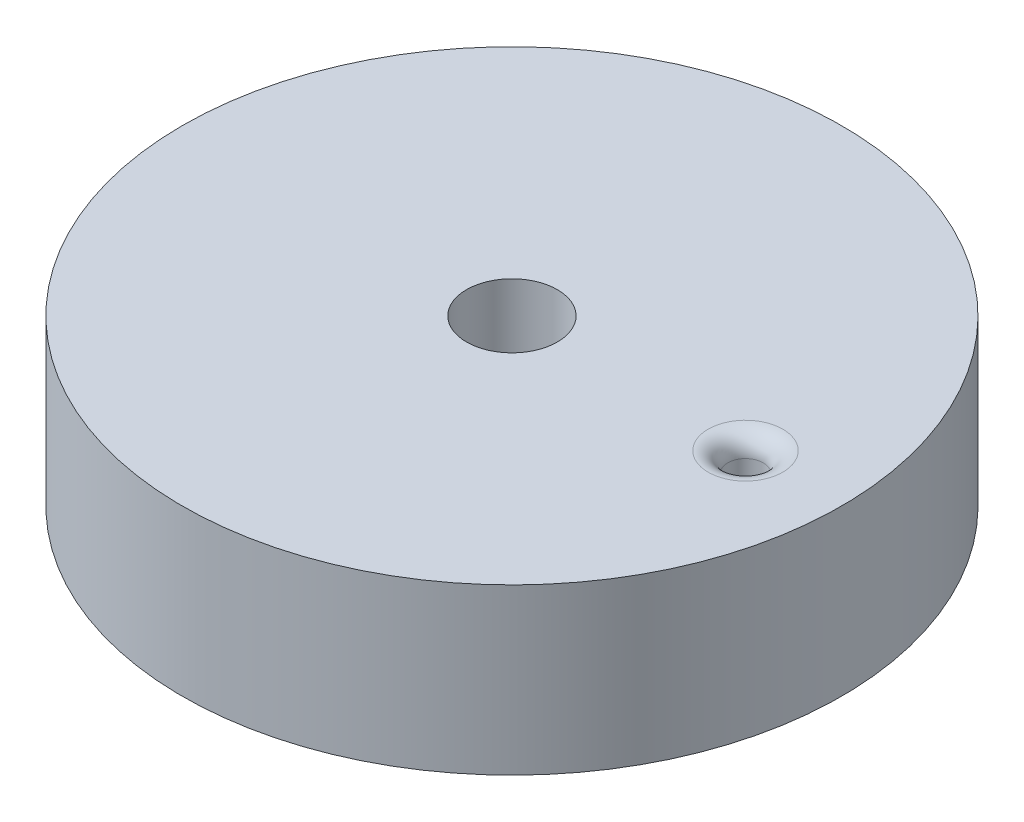
ISO-10303-21;
HEADER;
FILE_DESCRIPTION(('STEP AP214'),'2;1');
FILE_NAME('part.step','',(''),(''),'','','');
FILE_SCHEMA(('AUTOMOTIVE_DESIGN { 1 0 10303 214 1 1 1 1 }'));
ENDSEC;
DATA;
#1=APPLICATION_CONTEXT('core data for automotive mechanical design processes');
#2=APPLICATION_PROTOCOL_DEFINITION('international standard','automotive_design',2000,#1);
#3=PRODUCT_CONTEXT('',#1,'mechanical');
#4=PRODUCT('Part','Part','',(#3));
#5=PRODUCT_RELATED_PRODUCT_CATEGORY('part','',(#4));
#6=PRODUCT_DEFINITION_FORMATION('','',#4);
#7=PRODUCT_DEFINITION_CONTEXT('part definition',#1,'design');
#8=PRODUCT_DEFINITION('design','',#6,#7);
#9=PRODUCT_DEFINITION_SHAPE('','',#8);
#10=(LENGTH_UNIT() NAMED_UNIT(*) SI_UNIT(.MILLI.,.METRE.));
#11=(NAMED_UNIT(*) PLANE_ANGLE_UNIT() SI_UNIT($,.RADIAN.));
#12=(NAMED_UNIT(*) SI_UNIT($,.STERADIAN.) SOLID_ANGLE_UNIT());
#13=UNCERTAINTY_MEASURE_WITH_UNIT(LENGTH_MEASURE(1.E-05),#10,'distance_accuracy_value','');
#14=(GEOMETRIC_REPRESENTATION_CONTEXT(3) GLOBAL_UNCERTAINTY_ASSIGNED_CONTEXT((#13)) GLOBAL_UNIT_ASSIGNED_CONTEXT((#10,
#11,#12)) REPRESENTATION_CONTEXT('',''));
#15=CARTESIAN_POINT('',(0.,0.,0.));
#16=DIRECTION('',(0.,0.,1.));
#17=DIRECTION('',(1.,0.,0.));
#18=AXIS2_PLACEMENT_3D('',#15,#16,#17);
#19=CARTESIAN_POINT('',(0.,1.5,0.));
#20=DIRECTION('',(0.,-1.,0.));
#21=DIRECTION('',(0.,0.,-1.));
#22=AXIS2_PLACEMENT_3D('',#19,#20,#21);
#23=TOROIDAL_SURFACE('',#22,5.,1.5);
#24=CARTESIAN_POINT('',(0.,0.,0.));
#25=DIRECTION('',(0.,-1.,0.));
#26=DIRECTION('',(1.,0.,0.));
#27=AXIS2_PLACEMENT_3D('',#24,#25,#26);
#28=CIRCLE('',#27,5.);
#29=CARTESIAN_POINT('',(-5.,0.,0.));
#30=VERTEX_POINT('',#29);
#31=EDGE_CURVE('E9',#30,#30,#28,.T.);
#32=ORIENTED_EDGE('',*,*,#31,.T.);
#33=EDGE_LOOP('',(#32));
#34=FACE_BOUND('',#33,.T.);
#35=CARTESIAN_POINT('',(0.,1.5,0.));
#36=DIRECTION('',(0.,1.,0.));
#37=DIRECTION('',(1.,0.,0.));
#38=AXIS2_PLACEMENT_3D('',#35,#36,#37);
#39=CIRCLE('',#38,3.5);
#40=CARTESIAN_POINT('',(-3.5,1.5,0.));
#41=VERTEX_POINT('',#40);
#42=EDGE_CURVE('E26',#41,#41,#39,.T.);
#43=ORIENTED_EDGE('',*,*,#42,.T.);
#44=EDGE_LOOP('',(#43));
#45=FACE_BOUND('',#44,.T.);
#46=ADVANCED_FACE('F15',(#34,#45),#23,.T.);
#47=CARTESIAN_POINT('',(0.,0.,0.));
#48=DIRECTION('',(0.,-1.,0.));
#49=DIRECTION('',(1.,0.,0.));
#50=AXIS2_PLACEMENT_3D('',#47,#48,#49);
#51=CYLINDRICAL_SURFACE('',#50,3.5);
#52=CARTESIAN_POINT('',(0.,12.7,0.));
#53=DIRECTION('',(0.,-1.,0.));
#54=DIRECTION('',(1.,0.,0.));
#55=AXIS2_PLACEMENT_3D('',#52,#53,#54);
#56=CIRCLE('',#55,3.5);
#57=CARTESIAN_POINT('',(-3.5,12.7,0.));
#58=VERTEX_POINT('',#57);
#59=EDGE_CURVE('E51',#58,#58,#56,.T.);
#60=ORIENTED_EDGE('',*,*,#59,.F.);
#61=EDGE_LOOP('',(#60));
#62=FACE_BOUND('',#61,.T.);
#63=ORIENTED_EDGE('',*,*,#42,.F.);
#64=EDGE_LOOP('',(#63));
#65=FACE_BOUND('',#64,.T.);
#66=ADVANCED_FACE('F52',(#62,#65),#51,.F.);
#67=CARTESIAN_POINT('',(0.,0.,0.));
#68=DIRECTION('',(0.,1.,0.));
#69=DIRECTION('',(1.,0.,0.));
#70=AXIS2_PLACEMENT_3D('',#67,#68,#69);
#71=PLANE('',#70);
#72=CARTESIAN_POINT('',(0.,0.,0.));
#73=DIRECTION('',(0.,1.,0.));
#74=DIRECTION('',(1.,0.,0.));
#75=AXIS2_PLACEMENT_3D('',#72,#73,#74);
#76=CIRCLE('',#75,25.4);
#77=CARTESIAN_POINT('',(-25.4,0.,0.));
#78=VERTEX_POINT('',#77);
#79=EDGE_CURVE('E19',#78,#78,#76,.T.);
#80=ORIENTED_EDGE('',*,*,#79,.F.);
#81=EDGE_LOOP('',(#80));
#82=FACE_BOUND('',#81,.T.);
#83=CARTESIAN_POINT('',(18.,0.,0.));
#84=DIRECTION('',(0.,-1.,0.));
#85=DIRECTION('',(1.,0.,0.));
#86=AXIS2_PLACEMENT_3D('',#83,#84,#85);
#87=CIRCLE('',#86,1.375);
#88=CARTESIAN_POINT('',(16.625,0.,0.));
#89=VERTEX_POINT('',#88);
#90=EDGE_CURVE('E63',#89,#89,#87,.T.);
#91=ORIENTED_EDGE('',*,*,#90,.F.);
#92=EDGE_LOOP('',(#91));
#93=FACE_BOUND('',#92,.T.);
#94=ORIENTED_EDGE('',*,*,#31,.F.);
#95=EDGE_LOOP('',(#94));
#96=FACE_BOUND('',#95,.T.);
#97=ADVANCED_FACE('F17',(#82,#93,#96),#71,.F.);
#98=CARTESIAN_POINT('',(18.,11.2,0.));
#99=DIRECTION('',(0.,-1.,0.));
#100=DIRECTION('',(0.,0.,-1.));
#101=AXIS2_PLACEMENT_3D('',#98,#99,#100);
#102=TOROIDAL_SURFACE('',#101,2.875,1.5);
#103=CARTESIAN_POINT('',(18.,11.2,0.));
#104=DIRECTION('',(0.,-1.,0.));
#105=DIRECTION('',(1.,0.,0.));
#106=AXIS2_PLACEMENT_3D('',#103,#104,#105);
#107=CIRCLE('',#106,1.375);
#108=CARTESIAN_POINT('',(16.625,11.2,0.));
#109=VERTEX_POINT('',#108);
#110=EDGE_CURVE('E73',#109,#109,#107,.T.);
#111=ORIENTED_EDGE('',*,*,#110,.T.);
#112=EDGE_LOOP('',(#111));
#113=FACE_BOUND('',#112,.T.);
#114=CARTESIAN_POINT('',(18.,12.7,0.));
#115=DIRECTION('',(0.,1.,0.));
#116=DIRECTION('',(1.,0.,0.));
#117=AXIS2_PLACEMENT_3D('',#114,#115,#116);
#118=CIRCLE('',#117,2.875);
#119=CARTESIAN_POINT('',(15.125,12.7,0.));
#120=VERTEX_POINT('',#119);
#121=EDGE_CURVE('E70',#120,#120,#118,.T.);
#122=ORIENTED_EDGE('',*,*,#121,.T.);
#123=EDGE_LOOP('',(#122));
#124=FACE_BOUND('',#123,.T.);
#125=ADVANCED_FACE('F85',(#113,#124),#102,.T.);
#126=CARTESIAN_POINT('',(18.,0.,0.));
#127=DIRECTION('',(0.,-1.,0.));
#128=DIRECTION('',(1.,0.,0.));
#129=AXIS2_PLACEMENT_3D('',#126,#127,#128);
#130=CYLINDRICAL_SURFACE('',#129,1.375);
#131=ORIENTED_EDGE('',*,*,#90,.T.);
#132=EDGE_LOOP('',(#131));
#133=FACE_BOUND('',#132,.T.);
#134=ORIENTED_EDGE('',*,*,#110,.F.);
#135=EDGE_LOOP('',(#134));
#136=FACE_BOUND('',#135,.T.);
#137=ADVANCED_FACE('F90',(#133,#136),#130,.F.);
#138=CARTESIAN_POINT('',(0.,12.7,0.));
#139=DIRECTION('',(0.,1.,0.));
#140=DIRECTION('',(1.,0.,0.));
#141=AXIS2_PLACEMENT_3D('',#138,#139,#140);
#142=PLANE('',#141);
#143=CARTESIAN_POINT('',(0.,12.7,0.));
#144=DIRECTION('',(0.,1.,0.));
#145=DIRECTION('',(1.,0.,0.));
#146=AXIS2_PLACEMENT_3D('',#143,#144,#145);
#147=CIRCLE('',#146,25.4);
#148=CARTESIAN_POINT('',(-25.4,12.7,0.));
#149=VERTEX_POINT('',#148);
#150=EDGE_CURVE('E56',#149,#149,#147,.T.);
#151=ORIENTED_EDGE('',*,*,#150,.T.);
#152=EDGE_LOOP('',(#151));
#153=FACE_BOUND('',#152,.T.);
#154=ORIENTED_EDGE('',*,*,#59,.T.);
#155=EDGE_LOOP('',(#154));
#156=FACE_BOUND('',#155,.T.);
#157=ORIENTED_EDGE('',*,*,#121,.F.);
#158=EDGE_LOOP('',(#157));
#159=FACE_BOUND('',#158,.T.);
#160=ADVANCED_FACE('F87',(#153,#156,#159),#142,.T.);
#161=CARTESIAN_POINT('',(0.,0.,0.));
#162=DIRECTION('',(0.,-1.,0.));
#163=DIRECTION('',(1.,0.,0.));
#164=AXIS2_PLACEMENT_3D('',#161,#162,#163);
#165=CYLINDRICAL_SURFACE('',#164,25.4);
#166=ORIENTED_EDGE('',*,*,#150,.F.);
#167=EDGE_LOOP('',(#166));
#168=FACE_BOUND('',#167,.T.);
#169=ORIENTED_EDGE('',*,*,#79,.T.);
#170=EDGE_LOOP('',(#169));
#171=FACE_BOUND('',#170,.T.);
#172=ADVANCED_FACE('F89',(#168,#171),#165,.T.);
#173=CLOSED_SHELL('',(#46,#66,#97,#125,#137,#160,#172));
#174=MANIFOLD_SOLID_BREP('B1',#173);
#175=ADVANCED_BREP_SHAPE_REPRESENTATION('',(#18,#174),#14);
#176=SHAPE_DEFINITION_REPRESENTATION(#9,#175);
ENDSEC;
END-ISO-10303-21;
